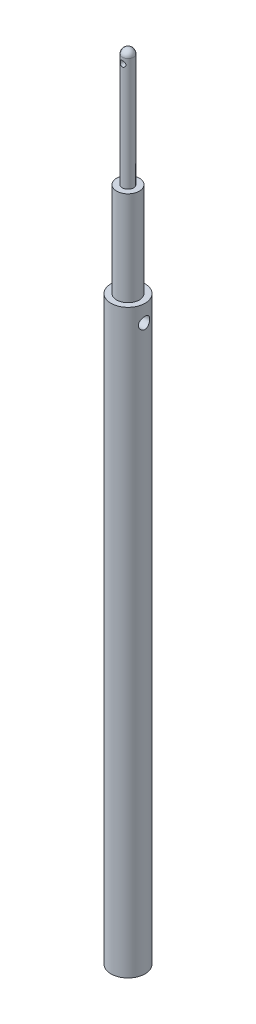
ISO-10303-21;
HEADER;
FILE_DESCRIPTION(('STEP AP214'),'2;1');
FILE_NAME('part.step','',(''),(''),'','','');
FILE_SCHEMA(('AUTOMOTIVE_DESIGN { 1 0 10303 214 1 1 1 1 }'));
ENDSEC;
DATA;
#1=APPLICATION_CONTEXT('core data for automotive mechanical design processes');
#2=APPLICATION_PROTOCOL_DEFINITION('international standard','automotive_design',2000,#1);
#3=PRODUCT_CONTEXT('',#1,'mechanical');
#4=PRODUCT('Part','Part','',(#3));
#5=PRODUCT_RELATED_PRODUCT_CATEGORY('part','',(#4));
#6=PRODUCT_DEFINITION_FORMATION('','',#4);
#7=PRODUCT_DEFINITION_CONTEXT('part definition',#1,'design');
#8=PRODUCT_DEFINITION('design','',#6,#7);
#9=PRODUCT_DEFINITION_SHAPE('','',#8);
#10=(LENGTH_UNIT() NAMED_UNIT(*) SI_UNIT(.MILLI.,.METRE.));
#11=(NAMED_UNIT(*) PLANE_ANGLE_UNIT() SI_UNIT($,.RADIAN.));
#12=(NAMED_UNIT(*) SI_UNIT($,.STERADIAN.) SOLID_ANGLE_UNIT());
#13=UNCERTAINTY_MEASURE_WITH_UNIT(LENGTH_MEASURE(1.E-05),#10,'distance_accuracy_value','');
#14=(GEOMETRIC_REPRESENTATION_CONTEXT(3) GLOBAL_UNCERTAINTY_ASSIGNED_CONTEXT((#13)) GLOBAL_UNIT_ASSIGNED_CONTEXT((#10,
#11,#12)) REPRESENTATION_CONTEXT('',''));
#15=CARTESIAN_POINT('',(0.,0.,0.));
#16=DIRECTION('',(0.,0.,1.));
#17=DIRECTION('',(1.,0.,0.));
#18=AXIS2_PLACEMENT_3D('',#15,#16,#17);
#19=CARTESIAN_POINT('',(0.,418.,0.));
#20=DIRECTION('',(0.,-1.,0.));
#21=DIRECTION('',(0.,0.,-1.));
#22=AXIS2_PLACEMENT_3D('',#19,#20,#21);
#23=CYLINDRICAL_SURFACE('',#22,3.);
#24=CARTESIAN_POINT('',(0.,418.,0.));
#25=DIRECTION('',(0.,1.,0.));
#26=DIRECTION('',(0.,0.,1.));
#27=AXIS2_PLACEMENT_3D('',#24,#25,#26);
#28=CIRCLE('',#27,3.);
#29=CARTESIAN_POINT('',(0.,418.,3.));
#30=VERTEX_POINT('',#29);
#31=EDGE_CURVE('E118',#30,#30,#28,.T.);
#32=ORIENTED_EDGE('',*,*,#31,.F.);
#33=EDGE_LOOP('',(#32));
#34=FACE_BOUND('',#33,.T.);
#35=CARTESIAN_POINT('',(0.,358.,0.));
#36=DIRECTION('',(0.,1.,0.));
#37=DIRECTION('',(0.,0.,1.));
#38=AXIS2_PLACEMENT_3D('',#35,#36,#37);
#39=CIRCLE('',#38,3.);
#40=CARTESIAN_POINT('',(0.,358.,3.));
#41=VERTEX_POINT('',#40);
#42=EDGE_CURVE('E116',#41,#41,#39,.T.);
#43=ORIENTED_EDGE('',*,*,#42,.T.);
#44=EDGE_LOOP('',(#43));
#45=FACE_BOUND('',#44,.T.);
#46=CARTESIAN_POINT('',(-1.5,415.,2.59807621135331));
#47=CARTESIAN_POINT('',(-1.4999945446118,414.921838287707,2.59808302092688));
#48=CARTESIAN_POINT('',(-1.49384995609982,414.843577882712,2.60165701781635));
#49=CARTESIAN_POINT('',(-1.46958481484707,414.689459102984,2.61543549678079));
#50=CARTESIAN_POINT('',(-1.45143909683126,414.613606127435,2.6256539108334));
#51=CARTESIAN_POINT('',(-1.40414992304971,414.466822503484,2.65124019908098));
#52=CARTESIAN_POINT('',(-1.37506492874058,414.39586802129,2.66658065209879));
#53=CARTESIAN_POINT('',(-1.30690128806453,414.259863697005,2.70063997225288));
#54=CARTESIAN_POINT('',(-1.26782210105363,414.194814174606,2.71935902214098));
#55=CARTESIAN_POINT('',(-1.17699981079629,414.066541407164,2.75995303586163));
#56=CARTESIAN_POINT('',(-1.12447805421562,414.00391129649,2.78196095456932));
#57=CARTESIAN_POINT('',(-1.00988071142167,413.88788741739,2.8255797417856));
#58=CARTESIAN_POINT('',(-0.947800388673409,413.834498256125,2.84719040746876));
#59=CARTESIAN_POINT('',(-0.810734345121788,413.734949273279,2.88932215429424));
#60=CARTESIAN_POINT('',(-0.735160783518827,413.689519348211,2.9096715962726));
#61=CARTESIAN_POINT('',(-0.57623553989922,413.612288720131,2.94526134149294));
#62=CARTESIAN_POINT('',(-0.492888807207199,413.580479415794,2.96050486775613));
#63=CARTESIAN_POINT('',(-0.327067415888929,413.533743008048,2.98320691866357));
#64=CARTESIAN_POINT('',(-0.244952685733186,413.517775710467,2.99114220331338));
#65=CARTESIAN_POINT('',(-0.0788559430467248,413.499750821988,3.00011375769101));
#66=CARTESIAN_POINT('',(0.00512490876565812,413.497684814806,3.00115420176885));
#67=CARTESIAN_POINT('',(0.164748786635673,413.507120010956,2.99644472874675));
#68=CARTESIAN_POINT('',(0.240481798765231,413.517457023282,2.9912774383824));
#69=CARTESIAN_POINT('',(0.388970657877525,413.549321265857,2.97561367889621));
#70=CARTESIAN_POINT('',(0.461726281640933,413.570849333464,2.9651168109959));
#71=CARTESIAN_POINT('',(0.603464087354379,413.624623849135,2.93957374931481));
#72=CARTESIAN_POINT('',(0.672380135272816,413.657014469758,2.92446662293798));
#73=CARTESIAN_POINT('',(0.803965202270043,413.731395124302,2.89106468980029));
#74=CARTESIAN_POINT('',(0.866631973258021,413.773388594954,2.87276874236224));
#75=CARTESIAN_POINT('',(0.990260491347345,413.8703430273,2.83266591598842));
#76=CARTESIAN_POINT('',(1.05050111254409,413.926154542489,2.81069063997261));
#77=CARTESIAN_POINT('',(1.1611565554467,414.046884587395,2.76681510880216));
#78=CARTESIAN_POINT('',(1.21156381736138,414.111810058411,2.74491492398442));
#79=CARTESIAN_POINT('',(1.30425800196334,414.253972288636,2.70216234138726));
#80=CARTESIAN_POINT('',(1.3458259724671,414.331729034581,2.6814647998606));
#81=CARTESIAN_POINT('',(1.41497866950187,414.494406507039,2.64563175417863));
#82=CARTESIAN_POINT('',(1.44257798731635,414.579319649526,2.630490450691));
#83=CARTESIAN_POINT('',(1.48077031653757,414.746821766924,2.60916953725551));
#84=CARTESIAN_POINT('',(1.49253768317997,414.829061678565,2.60237483772744));
#85=CARTESIAN_POINT('',(1.50227541991714,414.994602012275,2.59676879042414));
#86=CARTESIAN_POINT('',(1.50025553597253,415.07790164368,2.59795180333968));
#87=CARTESIAN_POINT('',(1.48355406501594,415.233480877868,2.60751504810878));
#88=CARTESIAN_POINT('',(1.47028172506869,415.305969176662,2.61509381259982));
#89=CARTESIAN_POINT('',(1.43354442694866,415.447551679407,2.63541032327012));
#90=CARTESIAN_POINT('',(1.41007616793542,415.51664477612,2.64814974007551));
#91=CARTESIAN_POINT('',(1.35247138290732,415.653116996354,2.67804333119485));
#92=CARTESIAN_POINT('',(1.31789109553907,415.72026852528,2.69537464864595));
#93=CARTESIAN_POINT('',(1.23943059602368,415.848203907309,2.73234179245876));
#94=CARTESIAN_POINT('',(1.19554560649829,415.90898446527,2.75197880032723));
#95=CARTESIAN_POINT('',(1.09325575079823,416.030468151285,2.79431997684506));
#96=CARTESIAN_POINT('',(1.0337179084724,416.090195726077,2.81709874731435));
#97=CARTESIAN_POINT('',(0.905106743097396,416.19911835699,2.8610135246684));
#98=CARTESIAN_POINT('',(0.836030211982995,416.248309855346,2.88214897511565));
#99=CARTESIAN_POINT('',(0.687803043838109,416.335860588925,2.92112042536436));
#100=CARTESIAN_POINT('',(0.60843464636113,416.373899677316,2.93885462508045));
#101=CARTESIAN_POINT('',(0.443283546961565,416.435706855786,2.96825032438952));
#102=CARTESIAN_POINT('',(0.3575065520882,416.459487477049,2.9799171551456));
#103=CARTESIAN_POINT('',(0.190469523495557,416.490052846262,2.99501262272825));
#104=CARTESIAN_POINT('',(0.109517165775619,416.498196813814,2.99909891862287));
#105=CARTESIAN_POINT('',(-0.0526889789268619,416.501264898182,3.00063195562697));
#106=CARTESIAN_POINT('',(-0.133942650442679,416.496193642785,2.99808102100335));
#107=CARTESIAN_POINT('',(-0.288806988475764,416.473875389807,2.98700953256884));
#108=CARTESIAN_POINT('',(-0.362568476716942,416.457452726114,2.97889342001984));
#109=CARTESIAN_POINT('',(-0.506168928275474,416.414009501046,2.95788140495134));
#110=CARTESIAN_POINT('',(-0.576007327433309,416.38698741986,2.94498481699193));
#111=CARTESIAN_POINT('',(-0.713135109367375,416.321909421751,2.91488896122179));
#112=CARTESIAN_POINT('',(-0.780187714050122,416.283431015188,2.89752925798197));
#113=CARTESIAN_POINT('',(-0.907161962721092,416.197063103711,2.86032199712737));
#114=CARTESIAN_POINT('',(-0.967080311122413,416.149169276327,2.84047329837539));
#115=CARTESIAN_POINT('',(-1.08437100623538,416.039804291466,2.7979291533994));
#116=CARTESIAN_POINT('',(-1.14089652680894,415.977456268784,2.77514698517546));
#117=CARTESIAN_POINT('',(-1.24299493109203,415.843823918305,2.73094614244278));
#118=CARTESIAN_POINT('',(-1.28855812501511,415.772531768698,2.70952868642797));
#119=CARTESIAN_POINT('',(-1.36864661967851,415.620045030129,2.66999407957373));
#120=CARTESIAN_POINT('',(-1.40277759894144,415.538608703307,2.65200261384404));
#121=CARTESIAN_POINT('',(-1.45631806425964,415.37000139349,2.62299234492526));
#122=CARTESIAN_POINT('',(-1.47577678676303,415.282850666631,2.61195024221552));
#123=CARTESIAN_POINT('',(-1.49155051179663,415.162291966522,2.60293908902685));
#124=CARTESIAN_POINT('',(-1.49471415744578,415.129948158403,2.60112193507727));
#125=CARTESIAN_POINT('',(-1.49894010763495,415.065075278977,2.59868903831625));
#126=CARTESIAN_POINT('',(-1.50000227159981,415.032546195421,2.59807337587663));
#127=CARTESIAN_POINT('',(-1.5,415.,2.59807621135331));
#128=B_SPLINE_CURVE_WITH_KNOTS('',3,(#46,#47,#48,#49,#50,#51,#52,#53,#54,#55,#56,#57,#58,#59,
#60,#61,#62,#63,#64,#65,#66,#67,#68,#69,#70,#71,#72,#73,#74,#75,#76,#77,#78,#79,#80,#81,#82,#83,
#84,#85,#86,#87,#88,#89,#90,#91,#92,#93,#94,#95,#96,#97,#98,#99,#100,#101,#102,#103,#104,#105,
#106,#107,#108,#109,#110,#111,#112,#113,#114,#115,#116,#117,#118,#119,#120,#121,#122,#123,#124,
#125,#126,#127),.UNSPECIFIED.,.T.,.F.,(4,2,2,2,2,2,2,2,2,2,2,2,2,2,2,2,2,2,2,2,2,2,2,2,2,2,2,2,
2,2,2,2,2,2,2,2,2,2,2,2,4),(0.,0.234348183892107,0.46918933923724,0.702792893878396,
0.936409088167805,1.18929346874738,1.44230356626559,1.71236838358148,1.98226240445841,
2.23295227451906,2.48349035529065,2.71224146226811,2.94100968776186,3.17294302096726,
3.40495949025411,3.65890787185342,3.91305072368883,4.18333262594173,4.45333161317564,
4.70193436281323,4.95036139782565,5.17161275136042,5.39293578654095,5.62450944609131,
5.85620229330077,6.11710115370923,6.37808797467306,6.64596272119451,6.91360169713163,
7.15668405584234,7.3996813019096,7.62666637307241,7.85368400268024,8.09041126079212,
8.32724745151081,8.58765362775106,8.84828914267736,9.11716123557913,9.38512699504145,
9.48270202777963,9.58028358741809),.UNSPECIFIED.);
#129=CARTESIAN_POINT('',(-1.5,415.,2.59807621135331));
#130=VERTEX_POINT('',#129);
#131=EDGE_CURVE('E97',#130,#130,#128,.T.);
#132=ORIENTED_EDGE('',*,*,#131,.F.);
#133=EDGE_LOOP('',(#132));
#134=FACE_BOUND('',#133,.T.);
#135=CARTESIAN_POINT('',(0.,416.5,-3.));
#136=CARTESIAN_POINT('',(0.0788579444268496,416.499995046524,-2.99999570107562));
#137=CARTESIAN_POINT('',(0.157809899546343,416.493744890319,-2.99685736529635));
#138=CARTESIAN_POINT('',(0.313380352903344,416.469020679488,-2.98461234055736));
#139=CARTESIAN_POINT('',(0.389994130070444,416.450523410503,-2.97549431743379));
#140=CARTESIAN_POINT('',(0.538400317320682,416.402209287075,-2.95224419105063));
#141=CARTESIAN_POINT('',(0.610210204408737,416.372436423628,-2.93813158766306));
#142=CARTESIAN_POINT('',(0.747708925209914,416.302644067953,-2.90618664773642));
#143=CARTESIAN_POINT('',(0.813398240985095,416.262625383627,-2.88835460450288));
#144=CARTESIAN_POINT('',(0.941261726642858,416.170724125772,-2.84934387387093));
#145=CARTESIAN_POINT('',(1.00298281668315,416.118270281141,-2.82802798691306));
#146=CARTESIAN_POINT('',(1.11716916730046,416.00421778113,-2.78489955370115));
#147=CARTESIAN_POINT('',(1.16962737466013,415.942612222341,-2.76308664313553));
#148=CARTESIAN_POINT('',(1.26787800067541,415.806274975715,-2.71948426796022));
#149=CARTESIAN_POINT('',(1.31283800332745,415.730895852481,-2.69782780455198));
#150=CARTESIAN_POINT('',(1.38925234033605,415.572448996021,-2.65928968158481));
#151=CARTESIAN_POINT('',(1.4207163224495,415.489386806916,-2.64240461410484));
#152=CARTESIAN_POINT('',(1.46719866328288,415.323002341867,-2.61686800556713));
#153=CARTESIAN_POINT('',(1.48308878562066,415.239993321899,-2.6077840737557));
#154=CARTESIAN_POINT('',(1.50064048996327,415.072031743331,-2.59772834922792));
#155=CARTESIAN_POINT('',(1.50231613255961,414.987081188693,-2.59674854014932));
#156=CARTESIAN_POINT('',(1.49203093075844,414.828570963527,-2.60266395385873));
#157=CARTESIAN_POINT('',(1.48167683930524,414.754863953165,-2.6086314549302));
#158=CARTESIAN_POINT('',(1.4504097735854,414.610417135941,-2.62614343100775));
#159=CARTESIAN_POINT('',(1.42949343584648,414.539678282042,-2.63768968247665));
#160=CARTESIAN_POINT('',(1.377314670579,414.401156301152,-2.66531214619112));
#161=CARTESIAN_POINT('',(1.34582260067399,414.333480401821,-2.68148760995998));
#162=CARTESIAN_POINT('',(1.273562531502,414.204048561115,-2.71655106422106));
#163=CARTESIAN_POINT('',(1.2327903657187,414.1422952966,-2.73544027170286));
#164=CARTESIAN_POINT('',(1.13709908236919,414.018218120885,-2.77669736854929));
#165=CARTESIAN_POINT('',(1.08104168755393,413.956814689636,-2.79920265355119));
#166=CARTESIAN_POINT('',(0.959333368112066,413.843896872114,-2.84321434950611));
#167=CARTESIAN_POINT('',(0.893677884861438,413.792387211949,-2.86472027938201));
#168=CARTESIAN_POINT('',(0.7507747587478,413.698471508455,-2.90552980924445));
#169=CARTESIAN_POINT('',(0.673130387399154,413.656599291331,-2.9246847624301));
#170=CARTESIAN_POINT('',(0.510699323233233,413.586854456436,-2.95736821681863));
#171=CARTESIAN_POINT('',(0.425918364397934,413.558970722477,-2.97090118415329));
#172=CARTESIAN_POINT('',(0.25914973749106,413.520286894425,-2.98986500612153));
#173=CARTESIAN_POINT('',(0.177512295822499,413.50826314638,-2.99587407451965));
#174=CARTESIAN_POINT('',(0.0131693999240395,413.497802903298,-3.00109520188655));
#175=CARTESIAN_POINT('',(-0.0695355298048512,413.499359971541,-3.00031048081978));
#176=CARTESIAN_POINT('',(-0.226849457978972,413.515310032628,-2.99236788380153));
#177=CARTESIAN_POINT('',(-0.301589112074889,413.528698799095,-2.98570868532253));
#178=CARTESIAN_POINT('',(-0.447610338452909,413.566357107843,-2.9673325697226));
#179=CARTESIAN_POINT('',(-0.518891528536628,413.59062784968,-2.95561509501618));
#180=CARTESIAN_POINT('',(-0.658332912674345,413.64999769965,-2.92776377120382));
#181=CARTESIAN_POINT('',(-0.726345595508678,413.685386575174,-2.91151322654447));
#182=CARTESIAN_POINT('',(-0.855692042548883,413.76566130347,-2.87615961476127));
#183=CARTESIAN_POINT('',(-0.917022944664875,413.810551201893,-2.85705533350408));
#184=CARTESIAN_POINT('',(-1.03765153393382,413.913640637996,-2.81562332004297));
#185=CARTESIAN_POINT('',(-1.09615811672853,413.972714302668,-2.79316327265249));
#186=CARTESIAN_POINT('',(-1.20278448167827,414.099887726917,-2.7489358741323));
#187=CARTESIAN_POINT('',(-1.2508970785678,414.167993678272,-2.72716901100071));
#188=CARTESIAN_POINT('',(-1.33756187171852,414.315465481259,-2.68576788309734));
#189=CARTESIAN_POINT('',(-1.37553824370037,414.395216899142,-2.66628794383591));
#190=CARTESIAN_POINT('',(-1.43712423890206,414.561265101362,-2.63361108441202));
#191=CARTESIAN_POINT('',(-1.46075237380053,414.6475532897,-2.62040607332625));
#192=CARTESIAN_POINT('',(-1.49079253120031,414.815365334327,-2.60342251538703));
#193=CARTESIAN_POINT('',(-1.49863949460818,414.896551380153,-2.59886075197597));
#194=CARTESIAN_POINT('',(-1.5010337315643,415.059170600747,-2.59748031962405));
#195=CARTESIAN_POINT('',(-1.49558676993486,415.140603653107,-2.60065829439585));
#196=CARTESIAN_POINT('',(-1.47288918838996,415.2932252523,-2.61356793076615));
#197=CARTESIAN_POINT('',(-1.45681247151455,415.364650705217,-2.62264641723988));
#198=CARTESIAN_POINT('',(-1.41476303733662,415.503712179137,-2.64556524281479));
#199=CARTESIAN_POINT('',(-1.38878713673988,415.571346973138,-2.65940711354503));
#200=CARTESIAN_POINT('',(-1.32572361795085,415.70593727648,-2.69142795546803));
#201=CARTESIAN_POINT('',(-1.28800670672356,415.772541852744,-2.7098358359388));
#202=CARTESIAN_POINT('',(-1.20322645745609,415.898911804272,-2.7485299745229));
#203=CARTESIAN_POINT('',(-1.15615825686233,415.958673595782,-2.76881720693416));
#204=CARTESIAN_POINT('',(-1.04730498999204,416.077212973532,-2.81193484737139));
#205=CARTESIAN_POINT('',(-0.984426634495881,416.134988653525,-2.83477474959943));
#206=CARTESIAN_POINT('',(-0.849232209349802,416.239394475153,-2.87816628389896));
#207=CARTESIAN_POINT('',(-0.776911084957813,416.286018609205,-2.89871667939292));
#208=CARTESIAN_POINT('',(-0.623897395174439,416.366854544068,-2.93547014349806));
#209=CARTESIAN_POINT('',(-0.543149255665109,416.400976253855,-2.95164144740899));
#210=CARTESIAN_POINT('',(-0.376113151707139,416.454712251636,-2.9775201194848));
#211=CARTESIAN_POINT('',(-0.289841699383661,416.474367770209,-2.98724585044602));
#212=CARTESIAN_POINT('',(-0.168902919736349,416.490846116629,-2.99543192870217));
#213=CARTESIAN_POINT('',(-0.135242819162353,416.4942739613,-2.99714048010376));
#214=CARTESIAN_POINT('',(-0.0677275977076402,416.498851998271,-2.99942545465223));
#215=CARTESIAN_POINT('',(-0.0338724714699441,416.500002127705,-3.00000184655071));
#216=CARTESIAN_POINT('',(0.,416.5,-3.));
#217=B_SPLINE_CURVE_WITH_KNOTS('',3,(#135,#136,#137,#138,#139,#140,#141,#142,#143,#144,#145,
#146,#147,#148,#149,#150,#151,#152,#153,#154,#155,#156,#157,#158,#159,#160,#161,#162,#163,#164,
#165,#166,#167,#168,#169,#170,#171,#172,#173,#174,#175,#176,#177,#178,#179,#180,#181,#182,#183,
#184,#185,#186,#187,#188,#189,#190,#191,#192,#193,#194,#195,#196,#197,#198,#199,#200,#201,#202,
#203,#204,#205,#206,#207,#208,#209,#210,#211,#212,#213,#214,#215,#216),.UNSPECIFIED.,.T.,.F.,(4,
2,2,2,2,2,2,2,2,2,2,2,2,2,2,2,2,2,2,2,2,2,2,2,2,2,2,2,2,2,2,2,2,2,2,2,2,2,2,2,4),(0.,
0.236436386130437,0.473322224563794,0.709293233238484,0.945245640872362,1.19547263807711,
1.44588935648103,1.71572589646132,1.98536921847422,2.23887018210343,2.49212035993531,
2.71508568613981,2.93812205888516,3.16635360252732,3.39468781890334,3.65197412000819,
3.90938301898026,4.17874533321656,4.44789325368419,4.69474935707017,4.94148846767213,
5.16910359759183,5.39674382446396,5.63089284041842,5.86514176122506,6.12239415966626,
6.37982382923143,6.64972023242587,6.91926767918179,7.16293961254574,7.40650589797016,
7.62686895373282,7.84730293182524,8.0825468517043,8.31791341715446,8.58187864135756,
8.84598575071867,9.11196020495287,9.37717362931723,9.47872920200874,9.58028757766598),.UNSPECIFIED.);
#218=CARTESIAN_POINT('',(0.,416.5,-3.));
#219=VERTEX_POINT('',#218);
#220=EDGE_CURVE('E35',#219,#219,#217,.T.);
#221=ORIENTED_EDGE('',*,*,#220,.F.);
#222=EDGE_LOOP('',(#221));
#223=FACE_BOUND('',#222,.T.);
#224=ADVANCED_FACE('F30',(#34,#45,#134,#223),#23,.T.);
#225=CARTESIAN_POINT('',(0.,308.,0.));
#226=DIRECTION('',(0.,-1.,0.));
#227=DIRECTION('',(0.,0.,-1.));
#228=AXIS2_PLACEMENT_3D('',#225,#226,#227);
#229=CYLINDRICAL_SURFACE('',#228,9.);
#230=CARTESIAN_POINT('',(-8.48528137423857,299.,-3.));
#231=CARTESIAN_POINT('',(-8.48528083591301,299.163404524508,-3.00000077384314));
#232=CARTESIAN_POINT('',(-8.49005307872572,299.326804399471,-2.98660435105657));
#233=CARTESIAN_POINT('',(-8.50852722243764,299.648763262983,-2.93355339506643));
#234=CARTESIAN_POINT('',(-8.52223059426566,299.807321449617,-2.89389453650519));
#235=CARTESIAN_POINT('',(-8.55684611066375,300.114880678992,-2.78986645705472));
#236=CARTESIAN_POINT('',(-8.57774411913965,300.263899788328,-2.72554566420975));
#237=CARTESIAN_POINT('',(-8.62437366030973,300.549080145644,-2.57418488532416));
#238=CARTESIAN_POINT('',(-8.65010625910837,300.685238547661,-2.48713988658055));
#239=CARTESIAN_POINT('',(-8.7046346822242,300.946159887015,-2.28915343932862));
#240=CARTESIAN_POINT('',(-8.73350684533932,301.070346286015,-2.17747302413376));
#241=CARTESIAN_POINT('',(-8.79041594403008,301.298620403674,-1.9349630016432));
#242=CARTESIAN_POINT('',(-8.81845274486885,301.402704894747,-1.80413032515713));
#243=CARTESIAN_POINT('',(-8.87141600765397,301.590436691989,-1.52281352389503));
#244=CARTESIAN_POINT('',(-8.89624223104816,301.673479911854,-1.37190573367357));
#245=CARTESIAN_POINT('',(-8.93908760312949,301.812774755383,-1.0572936689624));
#246=CARTESIAN_POINT('',(-8.95710858609006,301.869033599531,-0.893592857061609));
#247=CARTESIAN_POINT('',(-8.9837722629572,301.951207563897,-0.564086452300453));
#248=CARTESIAN_POINT('',(-8.99271944332677,301.978110338771,-0.398552264558879));
#249=CARTESIAN_POINT('',(-9.00130824654743,302.003948880082,-0.0650936244722485));
#250=CARTESIAN_POINT('',(-9.00095226788686,302.002891854957,0.102830200631707));
#251=CARTESIAN_POINT('',(-8.99118118856194,301.973467236302,0.429310545581458));
#252=CARTESIAN_POINT('',(-8.98212194265352,301.946172414577,0.587976145774982));
#253=CARTESIAN_POINT('',(-8.95640902019194,301.866821057059,0.898330316466528));
#254=CARTESIAN_POINT('',(-8.93975482893545,301.814762843061,1.05001841333766));
#255=CARTESIAN_POINT('',(-8.90027010879672,301.686736048082,1.34445742452593));
#256=CARTESIAN_POINT('',(-8.87736127572046,301.610462184361,1.48706466290655));
#257=CARTESIAN_POINT('',(-8.82775179116757,301.436420883654,1.75777297658198));
#258=CARTESIAN_POINT('',(-8.801050086044,301.338647470017,1.88587000315603));
#259=CARTESIAN_POINT('',(-8.74518575549689,301.118976819621,2.13030259965394));
#260=CARTESIAN_POINT('',(-8.71596645506633,300.996160526476,2.24580047119583));
#261=CARTESIAN_POINT('',(-8.65942005746702,300.73265382282,2.45483177879454));
#262=CARTESIAN_POINT('',(-8.63209325236846,300.591960662816,2.54836182984464));
#263=CARTESIAN_POINT('',(-8.58211575363336,300.29403912319,2.71196236510724));
#264=CARTESIAN_POINT('',(-8.55953727854243,300.136603606047,2.78167939086404));
#265=CARTESIAN_POINT('',(-8.52244952473154,299.811285817357,2.89332957980803));
#266=CARTESIAN_POINT('',(-8.50793686461278,299.643407956381,2.93527438724249));
#267=CARTESIAN_POINT('',(-8.48938908946755,299.310084933765,2.98848384629257));
#268=CARTESIAN_POINT('',(-8.48491080956267,299.144871725754,3.00104728652291));
#269=CARTESIAN_POINT('',(-8.48570016177553,298.814671552658,2.99881631672915));
#270=CARTESIAN_POINT('',(-8.49096602375444,298.649684551928,2.98402687568028));
#271=CARTESIAN_POINT('',(-8.51020854270898,298.330529102864,2.92867695465692));
#272=CARTESIAN_POINT('',(-8.52387976322521,298.176183709547,2.88901918194204));
#273=CARTESIAN_POINT('',(-8.55805661013069,297.876369181282,2.78614158768139));
#274=CARTESIAN_POINT('',(-8.57856344804519,297.730901625228,2.72291758909026));
#275=CARTESIAN_POINT('',(-8.62490632787361,297.447858737459,2.5724230222168));
#276=CARTESIAN_POINT('',(-8.65089076996885,297.310680072075,2.48445335507548));
#277=CARTESIAN_POINT('',(-8.70497306192896,297.052561842849,2.28775689167265));
#278=CARTESIAN_POINT('',(-8.73307153331384,296.931627084016,2.17902397649632));
#279=CARTESIAN_POINT('',(-8.78985115913548,296.703416047728,1.93767511770095));
#280=CARTESIAN_POINT('',(-8.8184953073369,296.597076829943,1.80416181163994));
#281=CARTESIAN_POINT('',(-8.87180554839327,296.408251572956,1.52048187420075));
#282=CARTESIAN_POINT('',(-8.89647178253085,296.325764686513,1.37031583459363));
#283=CARTESIAN_POINT('',(-8.93893217431809,296.187739685415,1.05833958729686));
#284=CARTESIAN_POINT('',(-8.95677090013594,296.132026168556,0.896613369963564));
#285=CARTESIAN_POINT('',(-8.98375832513324,296.04881677382,0.565375397538024));
#286=CARTESIAN_POINT('',(-8.99291016102056,296.021310710359,0.395866475861642));
#287=CARTESIAN_POINT('',(-9.00125589708769,295.996213767183,0.0624460075800955));
#288=CARTESIAN_POINT('',(-9.00089760268317,295.997277638203,-0.101354171760082));
#289=CARTESIAN_POINT('',(-8.99136589558194,296.025971924439,-0.426333435000545));
#290=CARTESIAN_POINT('',(-8.98219319800727,296.053600184458,-0.587512730457192));
#291=CARTESIAN_POINT('',(-8.95622744863237,296.133746703728,-0.900126358296195));
#292=CARTESIAN_POINT('',(-8.93955775083445,296.185862646059,-1.05167481273838));
#293=CARTESIAN_POINT('',(-8.90031482113485,296.313132593292,-1.3439350528194));
#294=CARTESIAN_POINT('',(-8.87774052144049,296.388290765591,-1.4846448724273));
#295=CARTESIAN_POINT('',(-8.82797606483642,296.562708536306,-1.75690204892637));
#296=CARTESIAN_POINT('',(-8.80064617475779,296.662756056145,-1.88791875467285));
#297=CARTESIAN_POINT('',(-8.74478966375638,296.882772173469,-2.1317430788173));
#298=CARTESIAN_POINT('',(-8.71626266319291,297.002747126788,-2.24454486487379));
#299=CARTESIAN_POINT('',(-8.65989839476794,297.264828066761,-2.45322542649937));
#300=CARTESIAN_POINT('',(-8.63213183965891,297.40761653293,-2.54826889799374));
#301=CARTESIAN_POINT('',(-8.58180579969045,297.708003280708,-2.71294302990338));
#302=CARTESIAN_POINT('',(-8.55924495483747,297.865597679089,-2.78258033045845));
#303=CARTESIAN_POINT('',(-8.52304002619543,298.183885472047,-2.89153148461251));
#304=CARTESIAN_POINT('',(-8.50903898571546,298.344116790576,-2.93207372744857));
#305=CARTESIAN_POINT('',(-8.49016150618554,298.6695681514,-2.98630296044781));
#306=CARTESIAN_POINT('',(-8.48528191852383,298.834786452232,-2.99999921758978));
#307=CARTESIAN_POINT('',(-8.48528137423857,299.,-3.));
#308=B_SPLINE_CURVE_WITH_KNOTS('',3,(#230,#231,#232,#233,#234,#235,#236,#237,#238,#239,#240,
#241,#242,#243,#244,#245,#246,#247,#248,#249,#250,#251,#252,#253,#254,#255,#256,#257,#258,#259,
#260,#261,#262,#263,#264,#265,#266,#267,#268,#269,#270,#271,#272,#273,#274,#275,#276,#277,#278,
#279,#280,#281,#282,#283,#284,#285,#286,#287,#288,#289,#290,#291,#292,#293,#294,#295,#296,#297,
#298,#299,#300,#301,#302,#303,#304,#305,#306,#307),.UNSPECIFIED.,.T.,.F.,(4,2,2,2,2,2,2,2,2,2,2,
2,2,2,2,2,2,2,2,2,2,2,2,2,2,2,2,2,2,2,2,2,2,2,2,2,2,2,4),(0.,0.489601754398063,
0.979284165045506,1.46800988250243,1.95684349855634,2.46304012282705,2.96931795515962,
3.48880518430974,4.0081522916037,4.50942956294805,5.01057759906984,5.49207014476708,
5.97359532567712,6.46144964581005,6.94943975622067,7.46040523091759,7.97144938836323,
8.48977919529174,9.00789154069851,9.50262874093332,9.99727607511707,10.4749318730634,
10.9526723744084,11.4455657320715,11.9386045698639,12.4553642451328,12.972105562726,
13.4854137357256,13.9985364901247,14.4875425403291,14.9765089202935,15.4577086812129,
15.9389955228973,16.4380655856191,16.937295132979,17.4560670820844,17.9747033480061,
18.4698963648808,18.9649184157139),.UNSPECIFIED.);
#309=CARTESIAN_POINT('',(-8.48528137423857,299.,-3.));
#310=VERTEX_POINT('',#309);
#311=EDGE_CURVE('E49',#310,#310,#308,.T.);
#312=ORIENTED_EDGE('',*,*,#311,.T.);
#313=EDGE_LOOP('',(#312));
#314=FACE_BOUND('',#313,.T.);
#315=CARTESIAN_POINT('',(8.48528137423857,299.,-3.));
#316=CARTESIAN_POINT('',(8.48528083591301,298.836595475492,-3.00000077384314));
#317=CARTESIAN_POINT('',(8.49005307872572,298.673195600529,-2.98660435105657));
#318=CARTESIAN_POINT('',(8.50852722243764,298.351236737017,-2.93355339506643));
#319=CARTESIAN_POINT('',(8.52223059426566,298.192678550383,-2.89389453650519));
#320=CARTESIAN_POINT('',(8.55684611066375,297.885119321008,-2.78986645705471));
#321=CARTESIAN_POINT('',(8.57774411913966,297.736100211672,-2.72554566420973));
#322=CARTESIAN_POINT('',(8.62437366030974,297.450919854356,-2.57418488532413));
#323=CARTESIAN_POINT('',(8.65010625910837,297.314761452339,-2.48713988658053));
#324=CARTESIAN_POINT('',(8.7046346822242,297.053840112985,-2.28915343932862));
#325=CARTESIAN_POINT('',(8.73350684533932,296.929653713985,-2.17747302413376));
#326=CARTESIAN_POINT('',(8.79041594403008,296.701379596326,-1.9349630016432));
#327=CARTESIAN_POINT('',(8.81845274486885,296.597295105253,-1.80413032515713));
#328=CARTESIAN_POINT('',(8.87141600765397,296.409563308011,-1.52281352389503));
#329=CARTESIAN_POINT('',(8.89624223104816,296.326520088146,-1.37190573367357));
#330=CARTESIAN_POINT('',(8.93908760312949,296.187225244617,-1.0572936689624));
#331=CARTESIAN_POINT('',(8.95710858609006,296.130966400469,-0.893592857061609));
#332=CARTESIAN_POINT('',(8.9837722629572,296.048792436103,-0.564086452300453));
#333=CARTESIAN_POINT('',(8.99271944332677,296.021889661229,-0.398552264558879));
#334=CARTESIAN_POINT('',(9.00130824654743,295.996051119918,-0.0650936244722485));
#335=CARTESIAN_POINT('',(9.00095226788686,295.997108145043,0.102830200631707));
#336=CARTESIAN_POINT('',(8.99118118856194,296.026532763698,0.429310545581458));
#337=CARTESIAN_POINT('',(8.98212194265352,296.053827585424,0.587976145774982));
#338=CARTESIAN_POINT('',(8.95640902019194,296.133178942941,0.898330316466528));
#339=CARTESIAN_POINT('',(8.93975482893545,296.185237156939,1.05001841333766));
#340=CARTESIAN_POINT('',(8.90027010879672,296.313263951918,1.34445742452593));
#341=CARTESIAN_POINT('',(8.87736127572046,296.38953781564,1.48706466290655));
#342=CARTESIAN_POINT('',(8.82775179116757,296.563579116346,1.75777297658198));
#343=CARTESIAN_POINT('',(8.801050086044,296.661352529983,1.88587000315603));
#344=CARTESIAN_POINT('',(8.74518575549689,296.881023180379,2.13030259965394));
#345=CARTESIAN_POINT('',(8.71596645506633,297.003839473524,2.24580047119583));
#346=CARTESIAN_POINT('',(8.65942005746702,297.26734617718,2.45483177879454));
#347=CARTESIAN_POINT('',(8.63209325236846,297.408039337184,2.54836182984464));
#348=CARTESIAN_POINT('',(8.58211575363336,297.70596087681,2.71196236510724));
#349=CARTESIAN_POINT('',(8.55953727854243,297.863396393953,2.78167939086404));
#350=CARTESIAN_POINT('',(8.52244952473154,298.188714182643,2.89332957980803));
#351=CARTESIAN_POINT('',(8.50793686461278,298.356592043619,2.93527438724249));
#352=CARTESIAN_POINT('',(8.48938908946755,298.689915066235,2.98848384629257));
#353=CARTESIAN_POINT('',(8.48491080956267,298.855128274246,3.00104728652291));
#354=CARTESIAN_POINT('',(8.48570016177553,299.185328447342,2.99881631672915));
#355=CARTESIAN_POINT('',(8.49096602375444,299.350315448072,2.98402687568028));
#356=CARTESIAN_POINT('',(8.51020854270898,299.669470897136,2.92867695465692));
#357=CARTESIAN_POINT('',(8.52387976322521,299.823816290453,2.88901918194204));
#358=CARTESIAN_POINT('',(8.55805661013069,300.123630818718,2.78614158768139));
#359=CARTESIAN_POINT('',(8.57856344804519,300.269098374772,2.72291758909026));
#360=CARTESIAN_POINT('',(8.62490632787361,300.552141262541,2.5724230222168));
#361=CARTESIAN_POINT('',(8.65089076996885,300.689319927925,2.48445335507548));
#362=CARTESIAN_POINT('',(8.70497306192896,300.947438157151,2.28775689167265));
#363=CARTESIAN_POINT('',(8.73307153331384,301.068372915984,2.17902397649632));
#364=CARTESIAN_POINT('',(8.78985115913548,301.296583952272,1.93767511770095));
#365=CARTESIAN_POINT('',(8.8184953073369,301.402923170057,1.80416181163994));
#366=CARTESIAN_POINT('',(8.87180554839327,301.591748427044,1.52048187420075));
#367=CARTESIAN_POINT('',(8.89647178253085,301.674235313487,1.37031583459363));
#368=CARTESIAN_POINT('',(8.93893217431809,301.812260314585,1.05833958729686));
#369=CARTESIAN_POINT('',(8.95677090013594,301.867973831444,0.896613369963564));
#370=CARTESIAN_POINT('',(8.98375832513324,301.95118322618,0.565375397538024));
#371=CARTESIAN_POINT('',(8.99291016102056,301.978689289642,0.395866475861642));
#372=CARTESIAN_POINT('',(9.00125589708769,302.003786232817,0.0624460075800955));
#373=CARTESIAN_POINT('',(9.00089760268317,302.002722361797,-0.101354171760082));
#374=CARTESIAN_POINT('',(8.99136589558194,301.974028075561,-0.426333435000545));
#375=CARTESIAN_POINT('',(8.98219319800727,301.946399815542,-0.587512730457192));
#376=CARTESIAN_POINT('',(8.95622744863237,301.866253296272,-0.900126358296195));
#377=CARTESIAN_POINT('',(8.93955775083445,301.814137353941,-1.05167481273838));
#378=CARTESIAN_POINT('',(8.90031482113485,301.686867406709,-1.3439350528194));
#379=CARTESIAN_POINT('',(8.87774052144049,301.611709234409,-1.4846448724273));
#380=CARTESIAN_POINT('',(8.82797606483643,301.437291463694,-1.75690204892635));
#381=CARTESIAN_POINT('',(8.8006461747578,301.337243943855,-1.88791875467281));
#382=CARTESIAN_POINT('',(8.74478966375639,301.117227826532,-2.13174307881727));
#383=CARTESIAN_POINT('',(8.71626266319291,300.997252873212,-2.24454486487378));
#384=CARTESIAN_POINT('',(8.65989839476794,300.735171933239,-2.45322542649936));
#385=CARTESIAN_POINT('',(8.63213183965891,300.59238346707,-2.54826889799372));
#386=CARTESIAN_POINT('',(8.58180579969045,300.291996719292,-2.71294302990336));
#387=CARTESIAN_POINT('',(8.55924495483747,300.134402320911,-2.78258033045844));
#388=CARTESIAN_POINT('',(8.52304002619543,299.816114527953,-2.89153148461251));
#389=CARTESIAN_POINT('',(8.50903898571546,299.655883209424,-2.93207372744857));
#390=CARTESIAN_POINT('',(8.49016150618554,299.3304318486,-2.98630296044781));
#391=CARTESIAN_POINT('',(8.48528191852383,299.165213547768,-2.99999921758978));
#392=CARTESIAN_POINT('',(8.48528137423857,299.,-3.));
#393=B_SPLINE_CURVE_WITH_KNOTS('',3,(#315,#316,#317,#318,#319,#320,#321,#322,#323,#324,#325,
#326,#327,#328,#329,#330,#331,#332,#333,#334,#335,#336,#337,#338,#339,#340,#341,#342,#343,#344,
#345,#346,#347,#348,#349,#350,#351,#352,#353,#354,#355,#356,#357,#358,#359,#360,#361,#362,#363,
#364,#365,#366,#367,#368,#369,#370,#371,#372,#373,#374,#375,#376,#377,#378,#379,#380,#381,#382,
#383,#384,#385,#386,#387,#388,#389,#390,#391,#392),.UNSPECIFIED.,.T.,.F.,(4,2,2,2,2,2,2,2,2,2,2,
2,2,2,2,2,2,2,2,2,2,2,2,2,2,2,2,2,2,2,2,2,2,2,2,2,2,2,4),(0.,0.489601754398063,
0.979284165045506,1.46800988250255,1.95684349855634,2.46304012282706,2.96931795515962,
3.48880518430974,4.00815229160371,4.50942956294805,5.01057759906984,5.49207014476708,
5.97359532567712,6.46144964581005,6.94943975622067,7.46040523091759,7.97144938836323,
8.48977919529174,9.00789154069851,9.50262874093332,9.99727607511707,10.4749318730634,
10.9526723744084,11.4455657320715,11.9386045698639,12.4553642451328,12.972105562726,
13.4854137357256,13.9985364901247,14.4875425403291,14.9765089202935,15.4577086812129,
15.9389955228973,16.438065585619,16.937295132979,17.4560670820844,17.9747033480061,
18.4698963648808,18.9649184157139),.UNSPECIFIED.);
#394=CARTESIAN_POINT('',(8.48528137423857,299.,-3.));
#395=VERTEX_POINT('',#394);
#396=EDGE_CURVE('E55',#395,#395,#393,.T.);
#397=ORIENTED_EDGE('',*,*,#396,.T.);
#398=EDGE_LOOP('',(#397));
#399=FACE_BOUND('',#398,.T.);
#400=CARTESIAN_POINT('',(0.,308.,0.));
#401=DIRECTION('',(0.,1.,0.));
#402=DIRECTION('',(0.,0.,1.));
#403=AXIS2_PLACEMENT_3D('',#400,#401,#402);
#404=CIRCLE('',#403,9.);
#405=CARTESIAN_POINT('',(0.,308.,9.));
#406=VERTEX_POINT('',#405);
#407=EDGE_CURVE('E10',#406,#406,#404,.T.);
#408=ORIENTED_EDGE('',*,*,#407,.F.);
#409=EDGE_LOOP('',(#408));
#410=FACE_BOUND('',#409,.T.);
#411=CARTESIAN_POINT('',(0.,0.,0.));
#412=DIRECTION('',(0.,1.,0.));
#413=DIRECTION('',(0.,0.,1.));
#414=AXIS2_PLACEMENT_3D('',#411,#412,#413);
#415=CIRCLE('',#414,9.);
#416=CARTESIAN_POINT('',(0.,0.,9.));
#417=VERTEX_POINT('',#416);
#418=EDGE_CURVE('E44',#417,#417,#415,.T.);
#419=ORIENTED_EDGE('',*,*,#418,.T.);
#420=EDGE_LOOP('',(#419));
#421=FACE_BOUND('',#420,.T.);
#422=ADVANCED_FACE('F32',(#314,#399,#410,#421),#229,.T.);
#423=CARTESIAN_POINT('',(0.,308.,0.));
#424=DIRECTION('',(0.,1.,0.));
#425=DIRECTION('',(0.,0.,1.));
#426=AXIS2_PLACEMENT_3D('',#423,#424,#425);
#427=PLANE('',#426);
#428=CARTESIAN_POINT('',(0.,308.,0.));
#429=DIRECTION('',(0.,1.,0.));
#430=DIRECTION('',(0.,0.,1.));
#431=AXIS2_PLACEMENT_3D('',#428,#429,#430);
#432=CIRCLE('',#431,6.);
#433=CARTESIAN_POINT('',(0.,308.,6.));
#434=VERTEX_POINT('',#433);
#435=EDGE_CURVE('E52',#434,#434,#432,.T.);
#436=ORIENTED_EDGE('',*,*,#435,.F.);
#437=EDGE_LOOP('',(#436));
#438=FACE_BOUND('',#437,.T.);
#439=ORIENTED_EDGE('',*,*,#407,.T.);
#440=EDGE_LOOP('',(#439));
#441=FACE_BOUND('',#440,.T.);
#442=ADVANCED_FACE('F75',(#438,#441),#427,.T.);
#443=CARTESIAN_POINT('',(0.,0.,0.));
#444=DIRECTION('',(0.,1.,0.));
#445=DIRECTION('',(0.,0.,1.));
#446=AXIS2_PLACEMENT_3D('',#443,#444,#445);
#447=PLANE('',#446);
#448=ORIENTED_EDGE('',*,*,#418,.F.);
#449=EDGE_LOOP('',(#448));
#450=FACE_BOUND('',#449,.T.);
#451=ADVANCED_FACE('F72',(#450),#447,.F.);
#452=CARTESIAN_POINT('',(-100.,299.,0.));
#453=DIRECTION('',(1.,0.,0.));
#454=DIRECTION('',(0.,0.,-1.));
#455=AXIS2_PLACEMENT_3D('',#452,#453,#454);
#456=CYLINDRICAL_SURFACE('',#455,3.);
#457=ORIENTED_EDGE('',*,*,#396,.F.);
#458=EDGE_LOOP('',(#457));
#459=FACE_BOUND('',#458,.T.);
#460=ORIENTED_EDGE('',*,*,#311,.F.);
#461=EDGE_LOOP('',(#460));
#462=FACE_BOUND('',#461,.T.);
#463=ADVANCED_FACE('F66',(#459,#462),#456,.F.);
#464=CARTESIAN_POINT('',(0.,358.,0.));
#465=DIRECTION('',(0.,-1.,0.));
#466=DIRECTION('',(0.,0.,-1.));
#467=AXIS2_PLACEMENT_3D('',#464,#465,#466);
#468=CYLINDRICAL_SURFACE('',#467,6.);
#469=CARTESIAN_POINT('',(0.,358.,0.));
#470=DIRECTION('',(0.,1.,0.));
#471=DIRECTION('',(0.,0.,1.));
#472=AXIS2_PLACEMENT_3D('',#469,#470,#471);
#473=CIRCLE('',#472,6.);
#474=CARTESIAN_POINT('',(0.,358.,6.));
#475=VERTEX_POINT('',#474);
#476=EDGE_CURVE('E62',#475,#475,#473,.T.);
#477=ORIENTED_EDGE('',*,*,#476,.F.);
#478=EDGE_LOOP('',(#477));
#479=FACE_BOUND('',#478,.T.);
#480=ORIENTED_EDGE('',*,*,#435,.T.);
#481=EDGE_LOOP('',(#480));
#482=FACE_BOUND('',#481,.T.);
#483=ADVANCED_FACE('F71',(#479,#482),#468,.T.);
#484=CARTESIAN_POINT('',(0.,358.,0.));
#485=DIRECTION('',(0.,1.,0.));
#486=DIRECTION('',(0.,0.,1.));
#487=AXIS2_PLACEMENT_3D('',#484,#485,#486);
#488=PLANE('',#487);
#489=ORIENTED_EDGE('',*,*,#42,.F.);
#490=EDGE_LOOP('',(#489));
#491=FACE_BOUND('',#490,.T.);
#492=ORIENTED_EDGE('',*,*,#476,.T.);
#493=EDGE_LOOP('',(#492));
#494=FACE_BOUND('',#493,.T.);
#495=ADVANCED_FACE('F95',(#491,#494),#488,.T.);
#496=CARTESIAN_POINT('',(0.,418.,0.));
#497=DIRECTION('',(1.,0.,0.));
#498=DIRECTION('',(0.,-1.,0.));
#499=AXIS2_PLACEMENT_3D('',#496,#497,#498);
#500=SPHERICAL_SURFACE('',#499,3.);
#501=CARTESIAN_POINT('',(0.,418.,0.));
#502=DIRECTION('',(0.,1.,0.));
#503=DIRECTION('',(0.,0.,1.));
#504=AXIS2_PLACEMENT_3D('',#501,#502,#503);
#505=SPHERICAL_SURFACE('',#504,3.);
#506=ORIENTED_EDGE('',*,*,#31,.T.);
#507=EDGE_LOOP('',(#506));
#508=FACE_BOUND('',#507,.T.);
#509=ADVANCED_FACE('F94',(#508),#505,.T.);
#510=CARTESIAN_POINT('',(0.,415.,30.));
#511=DIRECTION('',(0.,0.,-1.));
#512=DIRECTION('',(-1.,0.,0.));
#513=AXIS2_PLACEMENT_3D('',#510,#511,#512);
#514=CYLINDRICAL_SURFACE('',#513,1.5);
#515=ORIENTED_EDGE('',*,*,#131,.T.);
#516=EDGE_LOOP('',(#515));
#517=FACE_BOUND('',#516,.T.);
#518=ORIENTED_EDGE('',*,*,#220,.T.);
#519=EDGE_LOOP('',(#518));
#520=FACE_BOUND('',#519,.T.);
#521=ADVANCED_FACE('F102',(#517,#520),#514,.F.);
#522=CLOSED_SHELL('',(#224,#422,#442,#451,#463,#483,#495,#509,#521));
#523=MANIFOLD_SOLID_BREP('B2',#522);
#524=ADVANCED_BREP_SHAPE_REPRESENTATION('',(#18,#523),#14);
#525=SHAPE_DEFINITION_REPRESENTATION(#9,#524);
ENDSEC;
END-ISO-10303-21;
